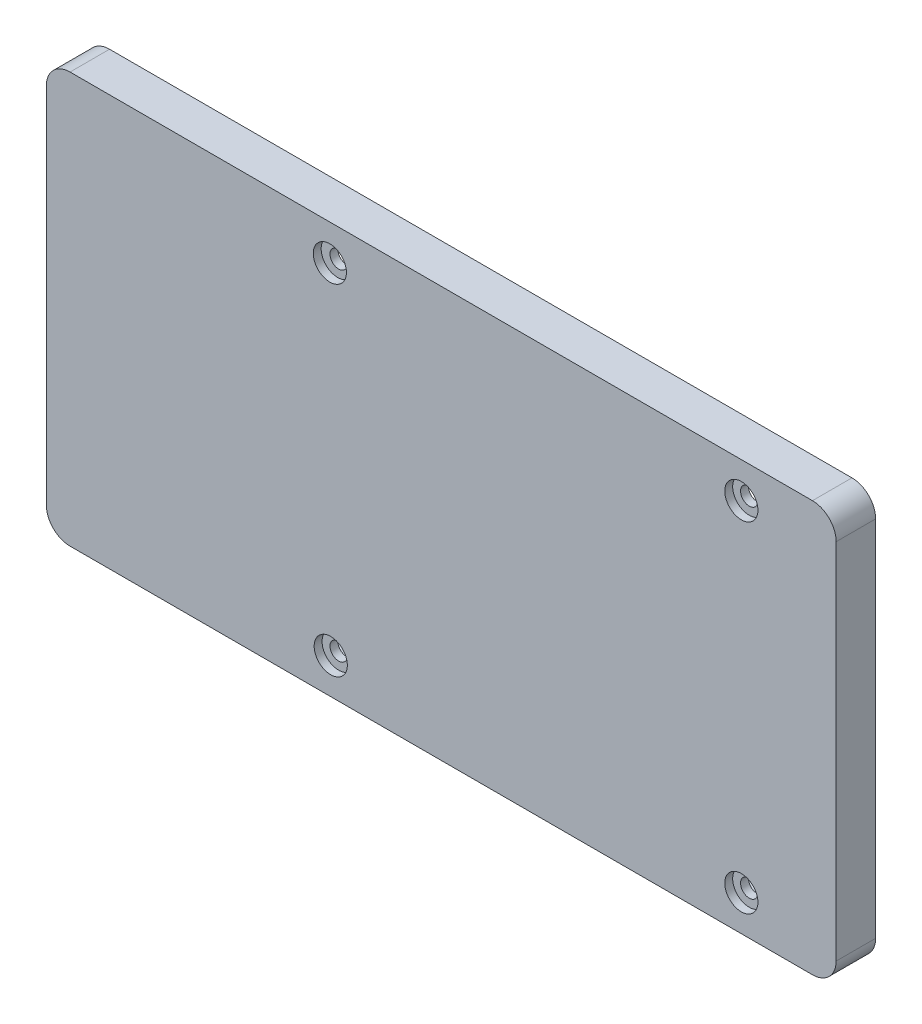
ISO-10303-21;
HEADER;
FILE_DESCRIPTION(('STEP AP214'),'2;1');
FILE_NAME('part.step','',(''),(''),'','','');
FILE_SCHEMA(('AUTOMOTIVE_DESIGN { 1 0 10303 214 1 1 1 1 }'));
ENDSEC;
DATA;
#1=APPLICATION_CONTEXT('core data for automotive mechanical design processes');
#2=APPLICATION_PROTOCOL_DEFINITION('international standard','automotive_design',2000,#1);
#3=PRODUCT_CONTEXT('',#1,'mechanical');
#4=PRODUCT('Part','Part','',(#3));
#5=PRODUCT_RELATED_PRODUCT_CATEGORY('part','',(#4));
#6=PRODUCT_DEFINITION_FORMATION('','',#4);
#7=PRODUCT_DEFINITION_CONTEXT('part definition',#1,'design');
#8=PRODUCT_DEFINITION('design','',#6,#7);
#9=PRODUCT_DEFINITION_SHAPE('','',#8);
#10=(LENGTH_UNIT() NAMED_UNIT(*) SI_UNIT(.MILLI.,.METRE.));
#11=(NAMED_UNIT(*) PLANE_ANGLE_UNIT() SI_UNIT($,.RADIAN.));
#12=(NAMED_UNIT(*) SI_UNIT($,.STERADIAN.) SOLID_ANGLE_UNIT());
#13=UNCERTAINTY_MEASURE_WITH_UNIT(LENGTH_MEASURE(1.E-05),#10,'distance_accuracy_value','');
#14=(GEOMETRIC_REPRESENTATION_CONTEXT(3) GLOBAL_UNCERTAINTY_ASSIGNED_CONTEXT((#13)) GLOBAL_UNIT_ASSIGNED_CONTEXT((#10,
#11,#12)) REPRESENTATION_CONTEXT('',''));
#15=CARTESIAN_POINT('',(0.,0.,0.));
#16=DIRECTION('',(0.,0.,1.));
#17=DIRECTION('',(1.,0.,0.));
#18=AXIS2_PLACEMENT_3D('',#15,#16,#17);
#19=CARTESIAN_POINT('',(972.388562725747,1041.63181831264,1066.88560292332));
#20=DIRECTION('',(0.,0.,1.));
#21=DIRECTION('',(1.,0.,0.));
#22=AXIS2_PLACEMENT_3D('',#19,#20,#21);
#23=CYLINDRICAL_SURFACE('',#22,1.09999999999997);
#24=CARTESIAN_POINT('',(972.388562725747,1041.63181831264,1069.88560292332));
#25=DIRECTION('',(0.,0.,-1.));
#26=DIRECTION('',(-1.,0.,0.));
#27=AXIS2_PLACEMENT_3D('',#24,#25,#26);
#28=CIRCLE('',#27,1.09999999999997);
#29=CARTESIAN_POINT('',(971.288562725748,1041.63181831264,1069.88560292332));
#30=VERTEX_POINT('',#29);
#31=EDGE_CURVE('E203',#30,#30,#28,.T.);
#32=ORIENTED_EDGE('',*,*,#31,.T.);
#33=EDGE_LOOP('',(#32));
#34=FACE_BOUND('',#33,.T.);
#35=CARTESIAN_POINT('',(972.388562725747,1041.63181831264,1070.88560292332));
#36=DIRECTION('',(0.,0.,1.));
#37=DIRECTION('',(1.,0.,0.));
#38=AXIS2_PLACEMENT_3D('',#35,#36,#37);
#39=CIRCLE('',#38,1.09999999999997);
#40=CARTESIAN_POINT('',(973.488562725747,1041.63181831264,1070.88560292332));
#41=VERTEX_POINT('',#40);
#42=EDGE_CURVE('E47',#41,#41,#39,.F.);
#43=ORIENTED_EDGE('',*,*,#42,.F.);
#44=EDGE_LOOP('',(#43));
#45=FACE_BOUND('',#44,.T.);
#46=ADVANCED_FACE('F43',(#34,#45),#23,.F.);
#47=CARTESIAN_POINT('',(972.388562725747,998.657114223238,1066.88560292332));
#48=DIRECTION('',(0.,0.,1.));
#49=DIRECTION('',(1.,0.,0.));
#50=AXIS2_PLACEMENT_3D('',#47,#48,#49);
#51=CYLINDRICAL_SURFACE('',#50,1.10000000000001);
#52=CARTESIAN_POINT('',(972.388562725747,998.657114223238,1069.88560292332));
#53=DIRECTION('',(0.,0.,-1.));
#54=DIRECTION('',(-1.,0.,0.));
#55=AXIS2_PLACEMENT_3D('',#52,#53,#54);
#56=CIRCLE('',#55,1.10000000000001);
#57=CARTESIAN_POINT('',(971.288562725748,998.657114223238,1069.88560292332));
#58=VERTEX_POINT('',#57);
#59=EDGE_CURVE('E207',#58,#58,#56,.T.);
#60=ORIENTED_EDGE('',*,*,#59,.T.);
#61=EDGE_LOOP('',(#60));
#62=FACE_BOUND('',#61,.T.);
#63=CARTESIAN_POINT('',(972.388562725747,998.657114223238,1070.88560292332));
#64=DIRECTION('',(0.,0.,1.));
#65=DIRECTION('',(1.,0.,0.));
#66=AXIS2_PLACEMENT_3D('',#63,#64,#65);
#67=CIRCLE('',#66,1.10000000000001);
#68=CARTESIAN_POINT('',(973.488562725747,998.657114223238,1070.88560292332));
#69=VERTEX_POINT('',#68);
#70=EDGE_CURVE('E316',#69,#69,#67,.F.);
#71=ORIENTED_EDGE('',*,*,#70,.F.);
#72=EDGE_LOOP('',(#71));
#73=FACE_BOUND('',#72,.T.);
#74=ADVANCED_FACE('F328',(#62,#73),#51,.F.);
#75=CARTESIAN_POINT('',(920.413762116146,998.657114223238,1066.88560292332));
#76=DIRECTION('',(0.,0.,1.));
#77=DIRECTION('',(1.,0.,0.));
#78=AXIS2_PLACEMENT_3D('',#75,#76,#77);
#79=CYLINDRICAL_SURFACE('',#78,1.10000000000001);
#80=CARTESIAN_POINT('',(920.413762116146,998.657114223238,1069.88560292332));
#81=DIRECTION('',(0.,0.,-1.));
#82=DIRECTION('',(-1.,0.,0.));
#83=AXIS2_PLACEMENT_3D('',#80,#81,#82);
#84=CIRCLE('',#83,1.10000000000001);
#85=CARTESIAN_POINT('',(919.313762116146,998.657114223238,1069.88560292332));
#86=VERTEX_POINT('',#85);
#87=EDGE_CURVE('E211',#86,#86,#84,.T.);
#88=ORIENTED_EDGE('',*,*,#87,.T.);
#89=EDGE_LOOP('',(#88));
#90=FACE_BOUND('',#89,.T.);
#91=CARTESIAN_POINT('',(920.413762116146,998.657114223238,1070.88560292332));
#92=DIRECTION('',(0.,0.,1.));
#93=DIRECTION('',(1.,0.,0.));
#94=AXIS2_PLACEMENT_3D('',#91,#92,#93);
#95=CIRCLE('',#94,1.10000000000001);
#96=CARTESIAN_POINT('',(921.513762116146,998.657114223238,1070.88560292332));
#97=VERTEX_POINT('',#96);
#98=EDGE_CURVE('E312',#97,#97,#95,.F.);
#99=ORIENTED_EDGE('',*,*,#98,.F.);
#100=EDGE_LOOP('',(#99));
#101=FACE_BOUND('',#100,.T.);
#102=ADVANCED_FACE('F334',(#90,#101),#79,.F.);
#103=CARTESIAN_POINT('',(920.413762116146,1041.63181831264,1066.88560292332));
#104=DIRECTION('',(0.,0.,1.));
#105=DIRECTION('',(1.,0.,0.));
#106=AXIS2_PLACEMENT_3D('',#103,#104,#105);
#107=CYLINDRICAL_SURFACE('',#106,1.09999999999997);
#108=CARTESIAN_POINT('',(920.413762116146,1041.63181831264,1069.88560292332));
#109=DIRECTION('',(0.,0.,-1.));
#110=DIRECTION('',(-1.,0.,0.));
#111=AXIS2_PLACEMENT_3D('',#108,#109,#110);
#112=CIRCLE('',#111,1.09999999999997);
#113=CARTESIAN_POINT('',(919.313762116146,1041.63181831264,1069.88560292332));
#114=VERTEX_POINT('',#113);
#115=EDGE_CURVE('E215',#114,#114,#112,.T.);
#116=ORIENTED_EDGE('',*,*,#115,.T.);
#117=EDGE_LOOP('',(#116));
#118=FACE_BOUND('',#117,.T.);
#119=CARTESIAN_POINT('',(920.413762116146,1041.63181831264,1070.88560292332));
#120=DIRECTION('',(0.,0.,1.));
#121=DIRECTION('',(1.,0.,0.));
#122=AXIS2_PLACEMENT_3D('',#119,#120,#121);
#123=CIRCLE('',#122,1.09999999999997);
#124=CARTESIAN_POINT('',(921.513762116146,1041.63181831264,1070.88560292332));
#125=VERTEX_POINT('',#124);
#126=EDGE_CURVE('E308',#125,#125,#123,.F.);
#127=ORIENTED_EDGE('',*,*,#126,.F.);
#128=EDGE_LOOP('',(#127));
#129=FACE_BOUND('',#128,.T.);
#130=ADVANCED_FACE('F339',(#118,#129),#107,.F.);
#131=CARTESIAN_POINT('',(884.413762116146,1046.13181831264,1071.88560292332));
#132=DIRECTION('',(1.,0.,0.));
#133=DIRECTION('',(0.,0.,-1.));
#134=AXIS2_PLACEMENT_3D('',#131,#132,#133);
#135=PLANE('',#134);
#136=DIRECTION('',(0.,-1.,0.));
#137=VECTOR('',#136,1.);
#138=CARTESIAN_POINT('',(884.413762116146,1046.13181831264,1066.88560292332));
#139=LINE('',#138,#137);
#140=CARTESIAN_POINT('',(884.413762116146,1043.13181831264,1066.88560292332));
#141=VERTEX_POINT('',#140);
#142=CARTESIAN_POINT('',(884.413762116146,997.157114223238,1066.88560292332));
#143=VERTEX_POINT('',#142);
#144=EDGE_CURVE('E188',#141,#143,#139,.T.);
#145=ORIENTED_EDGE('',*,*,#144,.T.);
#146=DIRECTION('',(0.,0.,-1.));
#147=VECTOR('',#146,1.);
#148=CARTESIAN_POINT('',(884.413762116146,997.157114223238,1071.88560292332));
#149=LINE('',#148,#147);
#150=CARTESIAN_POINT('',(884.413762116146,997.157114223238,1071.88560292332));
#151=VERTEX_POINT('',#150);
#152=EDGE_CURVE('E163',#143,#151,#149,.F.);
#153=ORIENTED_EDGE('',*,*,#152,.T.);
#154=DIRECTION('',(0.,-1.,0.));
#155=VECTOR('',#154,1.);
#156=CARTESIAN_POINT('',(884.413762116146,1046.13181831264,1071.88560292332));
#157=LINE('',#156,#155);
#158=CARTESIAN_POINT('',(884.413762116146,1043.13181831264,1071.88560292332));
#159=VERTEX_POINT('',#158);
#160=EDGE_CURVE('E202',#159,#151,#157,.T.);
#161=ORIENTED_EDGE('',*,*,#160,.F.);
#162=DIRECTION('',(0.,0.,-1.));
#163=VECTOR('',#162,1.);
#164=CARTESIAN_POINT('',(884.413762116146,1043.13181831264,1071.88560292332));
#165=LINE('',#164,#163);
#166=EDGE_CURVE('E169',#159,#141,#165,.T.);
#167=ORIENTED_EDGE('',*,*,#166,.T.);
#168=EDGE_LOOP('',(#145,#153,#161,#167));
#169=FACE_BOUND('',#168,.T.);
#170=ADVANCED_FACE('F377',(#169),#135,.F.);
#171=CARTESIAN_POINT('',(884.413762116146,994.157114223238,1071.88560292332));
#172=DIRECTION('',(0.,1.,0.));
#173=DIRECTION('',(0.,0.,1.));
#174=AXIS2_PLACEMENT_3D('',#171,#172,#173);
#175=PLANE('',#174);
#176=DIRECTION('',(1.,0.,0.));
#177=VECTOR('',#176,1.);
#178=CARTESIAN_POINT('',(884.413762116146,994.157114223238,1071.88560292332));
#179=LINE('',#178,#177);
#180=CARTESIAN_POINT('',(887.413762116146,994.157114223238,1071.88560292332));
#181=VERTEX_POINT('',#180);
#182=CARTESIAN_POINT('',(981.388562725748,994.157114223238,1071.88560292332));
#183=VERTEX_POINT('',#182);
#184=EDGE_CURVE('E179',#181,#183,#179,.T.);
#185=ORIENTED_EDGE('',*,*,#184,.F.);
#186=DIRECTION('',(0.,0.,-1.));
#187=VECTOR('',#186,1.);
#188=CARTESIAN_POINT('',(887.413762116146,994.157114223238,1071.88560292332));
#189=LINE('',#188,#187);
#190=CARTESIAN_POINT('',(887.413762116146,994.157114223238,1066.88560292332));
#191=VERTEX_POINT('',#190);
#192=EDGE_CURVE('E162',#181,#191,#189,.T.);
#193=ORIENTED_EDGE('',*,*,#192,.T.);
#194=DIRECTION('',(1.,0.,0.));
#195=VECTOR('',#194,1.);
#196=CARTESIAN_POINT('',(884.413762116146,994.157114223238,1066.88560292332));
#197=LINE('',#196,#195);
#198=CARTESIAN_POINT('',(981.388562725748,994.157114223238,1066.88560292332));
#199=VERTEX_POINT('',#198);
#200=EDGE_CURVE('E176',#191,#199,#197,.T.);
#201=ORIENTED_EDGE('',*,*,#200,.T.);
#202=DIRECTION('',(0.,0.,-1.));
#203=VECTOR('',#202,1.);
#204=CARTESIAN_POINT('',(981.388562725748,994.157114223238,1071.88560292332));
#205=LINE('',#204,#203);
#206=EDGE_CURVE('E182',#199,#183,#205,.F.);
#207=ORIENTED_EDGE('',*,*,#206,.T.);
#208=EDGE_LOOP('',(#185,#193,#201,#207));
#209=FACE_BOUND('',#208,.T.);
#210=ADVANCED_FACE('F175',(#209),#175,.F.);
#211=CARTESIAN_POINT('',(984.388562725748,1046.13181831264,1071.88560292332));
#212=DIRECTION('',(-1.,0.,0.));
#213=DIRECTION('',(0.,0.,1.));
#214=AXIS2_PLACEMENT_3D('',#211,#212,#213);
#215=PLANE('',#214);
#216=DIRECTION('',(0.,1.,0.));
#217=VECTOR('',#216,1.);
#218=CARTESIAN_POINT('',(984.388562725748,1046.13181831264,1071.88560292332));
#219=LINE('',#218,#217);
#220=CARTESIAN_POINT('',(984.388562725748,997.157114223238,1071.88560292332));
#221=VERTEX_POINT('',#220);
#222=CARTESIAN_POINT('',(984.388562725748,1043.13181831264,1071.88560292332));
#223=VERTEX_POINT('',#222);
#224=EDGE_CURVE('E453',#221,#223,#219,.T.);
#225=ORIENTED_EDGE('',*,*,#224,.F.);
#226=DIRECTION('',(0.,0.,-1.));
#227=VECTOR('',#226,1.);
#228=CARTESIAN_POINT('',(984.388562725748,997.157114223238,1071.88560292332));
#229=LINE('',#228,#227);
#230=CARTESIAN_POINT('',(984.388562725748,997.157114223238,1066.88560292332));
#231=VERTEX_POINT('',#230);
#232=EDGE_CURVE('E250',#221,#231,#229,.T.);
#233=ORIENTED_EDGE('',*,*,#232,.T.);
#234=DIRECTION('',(0.,1.,0.));
#235=VECTOR('',#234,1.);
#236=CARTESIAN_POINT('',(984.388562725748,1046.13181831264,1066.88560292332));
#237=LINE('',#236,#235);
#238=CARTESIAN_POINT('',(984.388562725748,1043.13181831264,1066.88560292332));
#239=VERTEX_POINT('',#238);
#240=EDGE_CURVE('E187',#231,#239,#237,.T.);
#241=ORIENTED_EDGE('',*,*,#240,.T.);
#242=DIRECTION('',(0.,0.,-1.));
#243=VECTOR('',#242,1.);
#244=CARTESIAN_POINT('',(984.388562725748,1043.13181831264,1071.88560292332));
#245=LINE('',#244,#243);
#246=EDGE_CURVE('E247',#239,#223,#245,.F.);
#247=ORIENTED_EDGE('',*,*,#246,.T.);
#248=EDGE_LOOP('',(#225,#233,#241,#247));
#249=FACE_BOUND('',#248,.T.);
#250=ADVANCED_FACE('F370',(#249),#215,.F.);
#251=CARTESIAN_POINT('',(884.413762116146,1046.13181831264,1071.88560292332));
#252=DIRECTION('',(0.,-1.,0.));
#253=DIRECTION('',(0.,0.,-1.));
#254=AXIS2_PLACEMENT_3D('',#251,#252,#253);
#255=PLANE('',#254);
#256=DIRECTION('',(-1.,0.,0.));
#257=VECTOR('',#256,1.);
#258=CARTESIAN_POINT('',(884.413762116146,1046.13181831264,1071.88560292332));
#259=LINE('',#258,#257);
#260=CARTESIAN_POINT('',(981.388562725748,1046.13181831264,1071.88560292332));
#261=VERTEX_POINT('',#260);
#262=CARTESIAN_POINT('',(887.413762116146,1046.13181831264,1071.88560292332));
#263=VERTEX_POINT('',#262);
#264=EDGE_CURVE('E221',#261,#263,#259,.T.);
#265=ORIENTED_EDGE('',*,*,#264,.F.);
#266=DIRECTION('',(0.,0.,-1.));
#267=VECTOR('',#266,1.);
#268=CARTESIAN_POINT('',(981.388562725748,1046.13181831264,1071.88560292332));
#269=LINE('',#268,#267);
#270=CARTESIAN_POINT('',(981.388562725748,1046.13181831264,1066.88560292332));
#271=VERTEX_POINT('',#270);
#272=EDGE_CURVE('E257',#261,#271,#269,.T.);
#273=ORIENTED_EDGE('',*,*,#272,.T.);
#274=DIRECTION('',(-1.,0.,0.));
#275=VECTOR('',#274,1.);
#276=CARTESIAN_POINT('',(884.413762116146,1046.13181831264,1066.88560292332));
#277=LINE('',#276,#275);
#278=CARTESIAN_POINT('',(887.413762116146,1046.13181831264,1066.88560292332));
#279=VERTEX_POINT('',#278);
#280=EDGE_CURVE('E193',#271,#279,#277,.T.);
#281=ORIENTED_EDGE('',*,*,#280,.T.);
#282=DIRECTION('',(0.,0.,-1.));
#283=VECTOR('',#282,1.);
#284=CARTESIAN_POINT('',(887.413762116146,1046.13181831264,1071.88560292332));
#285=LINE('',#284,#283);
#286=EDGE_CURVE('E254',#279,#263,#285,.F.);
#287=ORIENTED_EDGE('',*,*,#286,.T.);
#288=EDGE_LOOP('',(#265,#273,#281,#287));
#289=FACE_BOUND('',#288,.T.);
#290=ADVANCED_FACE('F364',(#289),#255,.F.);
#291=CARTESIAN_POINT('',(0.,0.,1071.88560292332));
#292=DIRECTION('',(0.,0.,1.));
#293=DIRECTION('',(1.,0.,0.));
#294=AXIS2_PLACEMENT_3D('',#291,#292,#293);
#295=PLANE('',#294);
#296=CARTESIAN_POINT('',(920.413762116146,998.657114223238,1071.88560292332));
#297=DIRECTION('',(0.,0.,1.));
#298=DIRECTION('',(1.,0.,0.));
#299=AXIS2_PLACEMENT_3D('',#296,#297,#298);
#300=CIRCLE('',#299,2.10000000000006);
#301=CARTESIAN_POINT('',(922.513762116146,998.657114223238,1071.88560292332));
#302=VERTEX_POINT('',#301);
#303=EDGE_CURVE('E492',#302,#302,#300,.T.);
#304=ORIENTED_EDGE('',*,*,#303,.F.);
#305=EDGE_LOOP('',(#304));
#306=FACE_BOUND('',#305,.T.);
#307=CARTESIAN_POINT('',(972.388562725747,998.657114223238,1071.88560292332));
#308=DIRECTION('',(0.,0.,1.));
#309=DIRECTION('',(1.,0.,0.));
#310=AXIS2_PLACEMENT_3D('',#307,#308,#309);
#311=CIRCLE('',#310,2.10000000000006);
#312=CARTESIAN_POINT('',(974.488562725748,998.657114223238,1071.88560292332));
#313=VERTEX_POINT('',#312);
#314=EDGE_CURVE('E500',#313,#313,#311,.T.);
#315=ORIENTED_EDGE('',*,*,#314,.F.);
#316=EDGE_LOOP('',(#315));
#317=FACE_BOUND('',#316,.T.);
#318=CARTESIAN_POINT('',(972.388562725747,1041.63181831264,1071.88560292332));
#319=DIRECTION('',(0.,0.,1.));
#320=DIRECTION('',(1.,0.,0.));
#321=AXIS2_PLACEMENT_3D('',#318,#319,#320);
#322=CIRCLE('',#321,2.10000000000002);
#323=CARTESIAN_POINT('',(974.488562725747,1041.63181831264,1071.88560292332));
#324=VERTEX_POINT('',#323);
#325=EDGE_CURVE('E484',#324,#324,#322,.T.);
#326=ORIENTED_EDGE('',*,*,#325,.F.);
#327=EDGE_LOOP('',(#326));
#328=FACE_BOUND('',#327,.T.);
#329=CARTESIAN_POINT('',(920.299535547693,1041.64450817802,1071.88560292332));
#330=DIRECTION('',(0.,0.,1.));
#331=DIRECTION('',(1.,0.,0.));
#332=AXIS2_PLACEMENT_3D('',#329,#330,#331);
#333=CIRCLE('',#332,2.10000000000002);
#334=CARTESIAN_POINT('',(922.399535547693,1041.64450817802,1071.88560292332));
#335=VERTEX_POINT('',#334);
#336=EDGE_CURVE('E480',#335,#335,#333,.T.);
#337=ORIENTED_EDGE('',*,*,#336,.F.);
#338=EDGE_LOOP('',(#337));
#339=FACE_BOUND('',#338,.T.);
#340=ORIENTED_EDGE('',*,*,#160,.T.);
#341=CARTESIAN_POINT('',(887.413762116146,997.157114223238,1071.88560292332));
#342=DIRECTION('',(0.,0.,1.));
#343=DIRECTION('',(1.,0.,0.));
#344=AXIS2_PLACEMENT_3D('',#341,#342,#343);
#345=CIRCLE('',#344,3.);
#346=EDGE_CURVE('E244',#151,#181,#345,.T.);
#347=ORIENTED_EDGE('',*,*,#346,.T.);
#348=ORIENTED_EDGE('',*,*,#184,.T.);
#349=CARTESIAN_POINT('',(981.388562725748,997.157114223238,1071.88560292332));
#350=DIRECTION('',(0.,0.,1.));
#351=DIRECTION('',(1.,0.,0.));
#352=AXIS2_PLACEMENT_3D('',#349,#350,#351);
#353=CIRCLE('',#352,3.);
#354=EDGE_CURVE('E241',#183,#221,#353,.T.);
#355=ORIENTED_EDGE('',*,*,#354,.T.);
#356=ORIENTED_EDGE('',*,*,#224,.T.);
#357=CARTESIAN_POINT('',(981.388562725748,1043.13181831264,1071.88560292332));
#358=DIRECTION('',(0.,0.,1.));
#359=DIRECTION('',(1.,0.,0.));
#360=AXIS2_PLACEMENT_3D('',#357,#358,#359);
#361=CIRCLE('',#360,3.);
#362=EDGE_CURVE('E238',#223,#261,#361,.T.);
#363=ORIENTED_EDGE('',*,*,#362,.T.);
#364=ORIENTED_EDGE('',*,*,#264,.T.);
#365=CARTESIAN_POINT('',(887.413762116146,1043.13181831264,1071.88560292332));
#366=DIRECTION('',(0.,0.,1.));
#367=DIRECTION('',(1.,0.,0.));
#368=AXIS2_PLACEMENT_3D('',#365,#366,#367);
#369=CIRCLE('',#368,3.);
#370=EDGE_CURVE('E235',#263,#159,#369,.T.);
#371=ORIENTED_EDGE('',*,*,#370,.T.);
#372=EDGE_LOOP('',(#340,#347,#348,#355,#356,#363,#364,#371));
#373=FACE_BOUND('',#372,.T.);
#374=ADVANCED_FACE('F361',(#306,#317,#328,#339,#373),#295,.T.);
#375=CARTESIAN_POINT('',(0.,0.,1066.88560292332));
#376=DIRECTION('',(0.,0.,1.));
#377=DIRECTION('',(1.,0.,0.));
#378=AXIS2_PLACEMENT_3D('',#375,#376,#377);
#379=PLANE('',#378);
#380=DIRECTION('',(-1.,0.,0.));
#381=VECTOR('',#380,1.);
#382=CARTESIAN_POINT('',(982.888562725748,995.657114223238,1066.88560292332));
#383=LINE('',#382,#381);
#384=CARTESIAN_POINT('',(980.888562725748,995.657114223238,1066.88560292332));
#385=VERTEX_POINT('',#384);
#386=CARTESIAN_POINT('',(887.913762116146,995.657114223238,1066.88560292332));
#387=VERTEX_POINT('',#386);
#388=EDGE_CURVE('E438',#385,#387,#383,.T.);
#389=ORIENTED_EDGE('',*,*,#388,.F.);
#390=CARTESIAN_POINT('',(980.888562725748,997.657114223238,1066.88560292332));
#391=DIRECTION('',(0.,0.,1.));
#392=DIRECTION('',(1.,0.,0.));
#393=AXIS2_PLACEMENT_3D('',#390,#391,#392);
#394=CIRCLE('',#393,2.);
#395=CARTESIAN_POINT('',(982.888562725748,997.657114223238,1066.88560292332));
#396=VERTEX_POINT('',#395);
#397=EDGE_CURVE('E53',#385,#396,#394,.T.);
#398=ORIENTED_EDGE('',*,*,#397,.T.);
#399=DIRECTION('',(0.,-1.,0.));
#400=VECTOR('',#399,1.);
#401=CARTESIAN_POINT('',(982.888562725748,1044.38797782496,1066.88560292332));
#402=LINE('',#401,#400);
#403=CARTESIAN_POINT('',(982.888562725748,1042.38797782496,1066.88560292332));
#404=VERTEX_POINT('',#403);
#405=EDGE_CURVE('E219',#404,#396,#402,.T.);
#406=ORIENTED_EDGE('',*,*,#405,.F.);
#407=CARTESIAN_POINT('',(980.888562725748,1042.38797782496,1066.88560292332));
#408=DIRECTION('',(0.,0.,1.));
#409=DIRECTION('',(1.,0.,0.));
#410=AXIS2_PLACEMENT_3D('',#407,#408,#409);
#411=CIRCLE('',#410,2.);
#412=CARTESIAN_POINT('',(980.888562725748,1044.38797782496,1066.88560292332));
#413=VERTEX_POINT('',#412);
#414=EDGE_CURVE('E11',#404,#413,#411,.T.);
#415=ORIENTED_EDGE('',*,*,#414,.T.);
#416=DIRECTION('',(1.,0.,0.));
#417=VECTOR('',#416,1.);
#418=CARTESIAN_POINT('',(982.888562725748,1044.38797782496,1066.88560292332));
#419=LINE('',#418,#417);
#420=CARTESIAN_POINT('',(887.913762116146,1044.38797782496,1066.88560292332));
#421=VERTEX_POINT('',#420);
#422=EDGE_CURVE('E429',#421,#413,#419,.T.);
#423=ORIENTED_EDGE('',*,*,#422,.F.);
#424=CARTESIAN_POINT('',(887.913762116146,1042.38797782496,1066.88560292332));
#425=DIRECTION('',(0.,0.,1.));
#426=DIRECTION('',(1.,0.,0.));
#427=AXIS2_PLACEMENT_3D('',#424,#425,#426);
#428=CIRCLE('',#427,2.);
#429=CARTESIAN_POINT('',(885.913762116146,1042.38797782496,1066.88560292332));
#430=VERTEX_POINT('',#429);
#431=EDGE_CURVE('E300',#421,#430,#428,.T.);
#432=ORIENTED_EDGE('',*,*,#431,.T.);
#433=DIRECTION('',(0.,1.,0.));
#434=VECTOR('',#433,1.);
#435=CARTESIAN_POINT('',(885.913762116146,1044.38797782496,1066.88560292332));
#436=LINE('',#435,#434);
#437=CARTESIAN_POINT('',(885.913762116146,997.657114223238,1066.88560292332));
#438=VERTEX_POINT('',#437);
#439=EDGE_CURVE('E441',#438,#430,#436,.T.);
#440=ORIENTED_EDGE('',*,*,#439,.F.);
#441=CARTESIAN_POINT('',(887.913762116146,997.657114223238,1066.88560292332));
#442=DIRECTION('',(0.,0.,1.));
#443=DIRECTION('',(1.,0.,0.));
#444=AXIS2_PLACEMENT_3D('',#441,#442,#443);
#445=CIRCLE('',#444,2.);
#446=EDGE_CURVE('E303',#438,#387,#445,.T.);
#447=ORIENTED_EDGE('',*,*,#446,.T.);
#448=EDGE_LOOP('',(#389,#398,#406,#415,#423,#432,#440,#447));
#449=FACE_BOUND('',#448,.T.);
#450=ORIENTED_EDGE('',*,*,#200,.F.);
#451=CARTESIAN_POINT('',(887.413762116146,997.157114223238,1066.88560292332));
#452=DIRECTION('',(0.,0.,1.));
#453=DIRECTION('',(1.,0.,0.));
#454=AXIS2_PLACEMENT_3D('',#451,#452,#453);
#455=CIRCLE('',#454,3.);
#456=EDGE_CURVE('E158',#191,#143,#455,.F.);
#457=ORIENTED_EDGE('',*,*,#456,.T.);
#458=ORIENTED_EDGE('',*,*,#144,.F.);
#459=CARTESIAN_POINT('',(887.413762116146,1043.13181831264,1066.88560292332));
#460=DIRECTION('',(0.,0.,1.));
#461=DIRECTION('',(1.,0.,0.));
#462=AXIS2_PLACEMENT_3D('',#459,#460,#461);
#463=CIRCLE('',#462,3.);
#464=EDGE_CURVE('E181',#141,#279,#463,.F.);
#465=ORIENTED_EDGE('',*,*,#464,.T.);
#466=ORIENTED_EDGE('',*,*,#280,.F.);
#467=CARTESIAN_POINT('',(981.388562725748,1043.13181831264,1066.88560292332));
#468=DIRECTION('',(0.,0.,1.));
#469=DIRECTION('',(1.,0.,0.));
#470=AXIS2_PLACEMENT_3D('',#467,#468,#469);
#471=CIRCLE('',#470,3.);
#472=EDGE_CURVE('E225',#271,#239,#471,.F.);
#473=ORIENTED_EDGE('',*,*,#472,.T.);
#474=ORIENTED_EDGE('',*,*,#240,.F.);
#475=CARTESIAN_POINT('',(981.388562725748,997.157114223238,1066.88560292332));
#476=DIRECTION('',(0.,0.,1.));
#477=DIRECTION('',(1.,0.,0.));
#478=AXIS2_PLACEMENT_3D('',#475,#476,#477);
#479=CIRCLE('',#478,3.);
#480=EDGE_CURVE('E170',#231,#199,#479,.F.);
#481=ORIENTED_EDGE('',*,*,#480,.T.);
#482=EDGE_LOOP('',(#450,#457,#458,#465,#466,#473,#474,#481));
#483=FACE_BOUND('',#482,.T.);
#484=ADVANCED_FACE('F184',(#449,#483),#379,.F.);
#485=CARTESIAN_POINT('',(982.888562725748,1044.38797782496,1069.88560292332));
#486=DIRECTION('',(1.,0.,0.));
#487=DIRECTION('',(0.,0.,-1.));
#488=AXIS2_PLACEMENT_3D('',#485,#486,#487);
#489=PLANE('',#488);
#490=ORIENTED_EDGE('',*,*,#405,.T.);
#491=DIRECTION('',(0.,0.,-1.));
#492=VECTOR('',#491,1.);
#493=CARTESIAN_POINT('',(982.888562725748,997.657114223238,1069.88560292332));
#494=LINE('',#493,#492);
#495=CARTESIAN_POINT('',(982.888562725748,997.657114223238,1069.88560292332));
#496=VERTEX_POINT('',#495);
#497=EDGE_CURVE('E297',#396,#496,#494,.F.);
#498=ORIENTED_EDGE('',*,*,#497,.T.);
#499=DIRECTION('',(0.,-1.,0.));
#500=VECTOR('',#499,1.);
#501=CARTESIAN_POINT('',(982.888562725748,1044.38797782496,1069.88560292332));
#502=LINE('',#501,#500);
#503=CARTESIAN_POINT('',(982.888562725748,1042.38797782496,1069.88560292332));
#504=VERTEX_POINT('',#503);
#505=EDGE_CURVE('E420',#504,#496,#502,.T.);
#506=ORIENTED_EDGE('',*,*,#505,.F.);
#507=DIRECTION('',(0.,0.,-1.));
#508=VECTOR('',#507,1.);
#509=CARTESIAN_POINT('',(982.888562725748,1042.38797782496,1066.88560292332));
#510=LINE('',#509,#508);
#511=EDGE_CURVE('E294',#504,#404,#510,.T.);
#512=ORIENTED_EDGE('',*,*,#511,.T.);
#513=EDGE_LOOP('',(#490,#498,#506,#512));
#514=FACE_BOUND('',#513,.T.);
#515=ADVANCED_FACE('F350',(#514),#489,.F.);
#516=CARTESIAN_POINT('',(982.888562725748,1044.38797782496,1069.88560292332));
#517=DIRECTION('',(0.,1.,0.));
#518=DIRECTION('',(0.,0.,1.));
#519=AXIS2_PLACEMENT_3D('',#516,#517,#518);
#520=PLANE('',#519);
#521=DIRECTION('',(1.,0.,0.));
#522=VECTOR('',#521,1.);
#523=CARTESIAN_POINT('',(982.888562725748,1044.38797782496,1069.88560292332));
#524=LINE('',#523,#522);
#525=CARTESIAN_POINT('',(887.913762116146,1044.38797782496,1069.88560292332));
#526=VERTEX_POINT('',#525);
#527=CARTESIAN_POINT('',(980.888562725748,1044.38797782496,1069.88560292332));
#528=VERTEX_POINT('',#527);
#529=EDGE_CURVE('E195',#526,#528,#524,.T.);
#530=ORIENTED_EDGE('',*,*,#529,.F.);
#531=DIRECTION('',(0.,0.,-1.));
#532=VECTOR('',#531,1.);
#533=CARTESIAN_POINT('',(887.913762116146,1044.38797782496,1066.88560292332));
#534=LINE('',#533,#532);
#535=EDGE_CURVE('E264',#526,#421,#534,.T.);
#536=ORIENTED_EDGE('',*,*,#535,.T.);
#537=ORIENTED_EDGE('',*,*,#422,.T.);
#538=DIRECTION('',(0.,0.,-1.));
#539=VECTOR('',#538,1.);
#540=CARTESIAN_POINT('',(980.888562725748,1044.38797782496,1069.88560292332));
#541=LINE('',#540,#539);
#542=EDGE_CURVE('E261',#413,#528,#541,.F.);
#543=ORIENTED_EDGE('',*,*,#542,.T.);
#544=EDGE_LOOP('',(#530,#536,#537,#543));
#545=FACE_BOUND('',#544,.T.);
#546=ADVANCED_FACE('F346',(#545),#520,.F.);
#547=CARTESIAN_POINT('',(885.913762116146,1044.38797782496,1069.88560292332));
#548=DIRECTION('',(-1.,0.,0.));
#549=DIRECTION('',(0.,0.,1.));
#550=AXIS2_PLACEMENT_3D('',#547,#548,#549);
#551=PLANE('',#550);
#552=ORIENTED_EDGE('',*,*,#439,.T.);
#553=DIRECTION('',(0.,0.,-1.));
#554=VECTOR('',#553,1.);
#555=CARTESIAN_POINT('',(885.913762116146,1042.38797782496,1069.88560292332));
#556=LINE('',#555,#554);
#557=CARTESIAN_POINT('',(885.913762116146,1042.38797782496,1069.88560292332));
#558=VERTEX_POINT('',#557);
#559=EDGE_CURVE('E272',#430,#558,#556,.F.);
#560=ORIENTED_EDGE('',*,*,#559,.T.);
#561=DIRECTION('',(0.,1.,0.));
#562=VECTOR('',#561,1.);
#563=CARTESIAN_POINT('',(885.913762116146,1044.38797782496,1069.88560292332));
#564=LINE('',#563,#562);
#565=CARTESIAN_POINT('',(885.913762116146,997.657114223238,1069.88560292332));
#566=VERTEX_POINT('',#565);
#567=EDGE_CURVE('E424',#566,#558,#564,.T.);
#568=ORIENTED_EDGE('',*,*,#567,.F.);
#569=DIRECTION('',(0.,0.,-1.));
#570=VECTOR('',#569,1.);
#571=CARTESIAN_POINT('',(885.913762116146,997.657114223238,1066.88560292332));
#572=LINE('',#571,#570);
#573=EDGE_CURVE('E268',#566,#438,#572,.T.);
#574=ORIENTED_EDGE('',*,*,#573,.T.);
#575=EDGE_LOOP('',(#552,#560,#568,#574));
#576=FACE_BOUND('',#575,.T.);
#577=ADVANCED_FACE('F349',(#576),#551,.F.);
#578=CARTESIAN_POINT('',(982.888562725748,995.657114223238,1069.88560292332));
#579=DIRECTION('',(0.,-1.,0.));
#580=DIRECTION('',(0.,0.,-1.));
#581=AXIS2_PLACEMENT_3D('',#578,#579,#580);
#582=PLANE('',#581);
#583=ORIENTED_EDGE('',*,*,#388,.T.);
#584=DIRECTION('',(0.,0.,-1.));
#585=VECTOR('',#584,1.);
#586=CARTESIAN_POINT('',(887.913762116146,995.657114223238,1069.88560292332));
#587=LINE('',#586,#585);
#588=CARTESIAN_POINT('',(887.913762116146,995.657114223238,1069.88560292332));
#589=VERTEX_POINT('',#588);
#590=EDGE_CURVE('E291',#387,#589,#587,.F.);
#591=ORIENTED_EDGE('',*,*,#590,.T.);
#592=DIRECTION('',(-1.,0.,0.));
#593=VECTOR('',#592,1.);
#594=CARTESIAN_POINT('',(982.888562725748,995.657114223238,1069.88560292332));
#595=LINE('',#594,#593);
#596=CARTESIAN_POINT('',(980.888562725748,995.657114223238,1069.88560292332));
#597=VERTEX_POINT('',#596);
#598=EDGE_CURVE('E417',#597,#589,#595,.T.);
#599=ORIENTED_EDGE('',*,*,#598,.F.);
#600=DIRECTION('',(0.,0.,-1.));
#601=VECTOR('',#600,1.);
#602=CARTESIAN_POINT('',(980.888562725748,995.657114223238,1066.88560292332));
#603=LINE('',#602,#601);
#604=EDGE_CURVE('E287',#597,#385,#603,.T.);
#605=ORIENTED_EDGE('',*,*,#604,.T.);
#606=EDGE_LOOP('',(#583,#591,#599,#605));
#607=FACE_BOUND('',#606,.T.);
#608=ADVANCED_FACE('F344',(#607),#582,.F.);
#609=CARTESIAN_POINT('',(0.,0.,1069.88560292332));
#610=DIRECTION('',(0.,0.,-1.));
#611=DIRECTION('',(-1.,0.,0.));
#612=AXIS2_PLACEMENT_3D('',#609,#610,#611);
#613=PLANE('',#612);
#614=ORIENTED_EDGE('',*,*,#115,.F.);
#615=EDGE_LOOP('',(#614));
#616=FACE_BOUND('',#615,.T.);
#617=ORIENTED_EDGE('',*,*,#87,.F.);
#618=EDGE_LOOP('',(#617));
#619=FACE_BOUND('',#618,.T.);
#620=ORIENTED_EDGE('',*,*,#59,.F.);
#621=EDGE_LOOP('',(#620));
#622=FACE_BOUND('',#621,.T.);
#623=ORIENTED_EDGE('',*,*,#31,.F.);
#624=EDGE_LOOP('',(#623));
#625=FACE_BOUND('',#624,.T.);
#626=ORIENTED_EDGE('',*,*,#567,.T.);
#627=CARTESIAN_POINT('',(887.913762116146,1042.38797782496,1069.88560292332));
#628=DIRECTION('',(0.,0.,-1.));
#629=DIRECTION('',(-1.,0.,0.));
#630=AXIS2_PLACEMENT_3D('',#627,#628,#629);
#631=CIRCLE('',#630,2.);
#632=EDGE_CURVE('E284',#558,#526,#631,.T.);
#633=ORIENTED_EDGE('',*,*,#632,.T.);
#634=ORIENTED_EDGE('',*,*,#529,.T.);
#635=CARTESIAN_POINT('',(980.888562725748,1042.38797782496,1069.88560292332));
#636=DIRECTION('',(0.,0.,-1.));
#637=DIRECTION('',(-1.,0.,0.));
#638=AXIS2_PLACEMENT_3D('',#635,#636,#637);
#639=CIRCLE('',#638,2.);
#640=EDGE_CURVE('E275',#528,#504,#639,.T.);
#641=ORIENTED_EDGE('',*,*,#640,.T.);
#642=ORIENTED_EDGE('',*,*,#505,.T.);
#643=CARTESIAN_POINT('',(980.888562725748,997.657114223238,1069.88560292332));
#644=DIRECTION('',(0.,0.,-1.));
#645=DIRECTION('',(-1.,0.,0.));
#646=AXIS2_PLACEMENT_3D('',#643,#644,#645);
#647=CIRCLE('',#646,2.);
#648=EDGE_CURVE('E278',#496,#597,#647,.T.);
#649=ORIENTED_EDGE('',*,*,#648,.T.);
#650=ORIENTED_EDGE('',*,*,#598,.T.);
#651=CARTESIAN_POINT('',(887.913762116146,997.657114223238,1069.88560292332));
#652=DIRECTION('',(0.,0.,-1.));
#653=DIRECTION('',(-1.,0.,0.));
#654=AXIS2_PLACEMENT_3D('',#651,#652,#653);
#655=CIRCLE('',#654,2.);
#656=EDGE_CURVE('E281',#589,#566,#655,.T.);
#657=ORIENTED_EDGE('',*,*,#656,.T.);
#658=EDGE_LOOP('',(#626,#633,#634,#641,#642,#649,#650,#657));
#659=FACE_BOUND('',#658,.T.);
#660=ADVANCED_FACE('F341',(#616,#619,#622,#625,#659),#613,.T.);
#661=CARTESIAN_POINT('',(887.413762116146,997.157114223238,1071.88560292332));
#662=DIRECTION('',(0.,0.,-1.));
#663=DIRECTION('',(-1.,0.,0.));
#664=AXIS2_PLACEMENT_3D('',#661,#662,#663);
#665=CYLINDRICAL_SURFACE('',#664,3.);
#666=ORIENTED_EDGE('',*,*,#346,.F.);
#667=ORIENTED_EDGE('',*,*,#152,.F.);
#668=ORIENTED_EDGE('',*,*,#456,.F.);
#669=ORIENTED_EDGE('',*,*,#192,.F.);
#670=EDGE_LOOP('',(#666,#667,#668,#669));
#671=FACE_BOUND('',#670,.T.);
#672=ADVANCED_FACE('F161',(#671),#665,.T.);
#673=CARTESIAN_POINT('',(981.388562725748,997.157114223238,1071.88560292332));
#674=DIRECTION('',(0.,0.,-1.));
#675=DIRECTION('',(-1.,0.,0.));
#676=AXIS2_PLACEMENT_3D('',#673,#674,#675);
#677=CYLINDRICAL_SURFACE('',#676,3.);
#678=ORIENTED_EDGE('',*,*,#354,.F.);
#679=ORIENTED_EDGE('',*,*,#206,.F.);
#680=ORIENTED_EDGE('',*,*,#480,.F.);
#681=ORIENTED_EDGE('',*,*,#232,.F.);
#682=EDGE_LOOP('',(#678,#679,#680,#681));
#683=FACE_BOUND('',#682,.T.);
#684=ADVANCED_FACE('F383',(#683),#677,.T.);
#685=CARTESIAN_POINT('',(981.388562725748,1043.13181831264,1071.88560292332));
#686=DIRECTION('',(0.,0.,-1.));
#687=DIRECTION('',(-1.,0.,0.));
#688=AXIS2_PLACEMENT_3D('',#685,#686,#687);
#689=CYLINDRICAL_SURFACE('',#688,3.);
#690=ORIENTED_EDGE('',*,*,#362,.F.);
#691=ORIENTED_EDGE('',*,*,#246,.F.);
#692=ORIENTED_EDGE('',*,*,#472,.F.);
#693=ORIENTED_EDGE('',*,*,#272,.F.);
#694=EDGE_LOOP('',(#690,#691,#692,#693));
#695=FACE_BOUND('',#694,.T.);
#696=ADVANCED_FACE('F386',(#695),#689,.T.);
#697=CARTESIAN_POINT('',(887.413762116146,1043.13181831264,1071.88560292332));
#698=DIRECTION('',(0.,0.,-1.));
#699=DIRECTION('',(-1.,0.,0.));
#700=AXIS2_PLACEMENT_3D('',#697,#698,#699);
#701=CYLINDRICAL_SURFACE('',#700,3.);
#702=ORIENTED_EDGE('',*,*,#370,.F.);
#703=ORIENTED_EDGE('',*,*,#286,.F.);
#704=ORIENTED_EDGE('',*,*,#464,.F.);
#705=ORIENTED_EDGE('',*,*,#166,.F.);
#706=EDGE_LOOP('',(#702,#703,#704,#705));
#707=FACE_BOUND('',#706,.T.);
#708=ADVANCED_FACE('F390',(#707),#701,.T.);
#709=CARTESIAN_POINT('',(887.913762116146,1042.38797782496,1069.88560292332));
#710=DIRECTION('',(0.,0.,1.));
#711=DIRECTION('',(1.,0.,0.));
#712=AXIS2_PLACEMENT_3D('',#709,#710,#711);
#713=CYLINDRICAL_SURFACE('',#712,2.);
#714=ORIENTED_EDGE('',*,*,#632,.F.);
#715=ORIENTED_EDGE('',*,*,#559,.F.);
#716=ORIENTED_EDGE('',*,*,#431,.F.);
#717=ORIENTED_EDGE('',*,*,#535,.F.);
#718=EDGE_LOOP('',(#714,#715,#716,#717));
#719=FACE_BOUND('',#718,.T.);
#720=ADVANCED_FACE('F394',(#719),#713,.F.);
#721=CARTESIAN_POINT('',(887.913762116146,997.657114223238,1069.88560292332));
#722=DIRECTION('',(0.,0.,1.));
#723=DIRECTION('',(1.,0.,0.));
#724=AXIS2_PLACEMENT_3D('',#721,#722,#723);
#725=CYLINDRICAL_SURFACE('',#724,2.);
#726=ORIENTED_EDGE('',*,*,#656,.F.);
#727=ORIENTED_EDGE('',*,*,#590,.F.);
#728=ORIENTED_EDGE('',*,*,#446,.F.);
#729=ORIENTED_EDGE('',*,*,#573,.F.);
#730=EDGE_LOOP('',(#726,#727,#728,#729));
#731=FACE_BOUND('',#730,.T.);
#732=ADVANCED_FACE('F398',(#731),#725,.F.);
#733=CARTESIAN_POINT('',(980.888562725748,997.657114223238,1069.88560292332));
#734=DIRECTION('',(0.,0.,1.));
#735=DIRECTION('',(1.,0.,0.));
#736=AXIS2_PLACEMENT_3D('',#733,#734,#735);
#737=CYLINDRICAL_SURFACE('',#736,2.);
#738=ORIENTED_EDGE('',*,*,#648,.F.);
#739=ORIENTED_EDGE('',*,*,#497,.F.);
#740=ORIENTED_EDGE('',*,*,#397,.F.);
#741=ORIENTED_EDGE('',*,*,#604,.F.);
#742=EDGE_LOOP('',(#738,#739,#740,#741));
#743=FACE_BOUND('',#742,.T.);
#744=ADVANCED_FACE('F401',(#743),#737,.F.);
#745=CARTESIAN_POINT('',(980.888562725748,1042.38797782496,1069.88560292332));
#746=DIRECTION('',(0.,0.,1.));
#747=DIRECTION('',(1.,0.,0.));
#748=AXIS2_PLACEMENT_3D('',#745,#746,#747);
#749=CYLINDRICAL_SURFACE('',#748,2.);
#750=ORIENTED_EDGE('',*,*,#640,.F.);
#751=ORIENTED_EDGE('',*,*,#542,.F.);
#752=ORIENTED_EDGE('',*,*,#414,.F.);
#753=ORIENTED_EDGE('',*,*,#511,.F.);
#754=EDGE_LOOP('',(#750,#751,#752,#753));
#755=FACE_BOUND('',#754,.T.);
#756=ADVANCED_FACE('F45',(#755),#749,.F.);
#757=CARTESIAN_POINT('',(920.299535547693,1041.64450817802,1070.88560292332));
#758=DIRECTION('',(0.,0.,1.));
#759=DIRECTION('',(1.,0.,0.));
#760=AXIS2_PLACEMENT_3D('',#757,#758,#759);
#761=PLANE('',#760);
#762=CARTESIAN_POINT('',(920.299535547693,1041.64450817802,1070.88560292332));
#763=DIRECTION('',(0.,0.,1.));
#764=DIRECTION('',(1.,0.,0.));
#765=AXIS2_PLACEMENT_3D('',#762,#763,#764);
#766=CIRCLE('',#765,2.10000000000002);
#767=CARTESIAN_POINT('',(922.399535547693,1041.64450817802,1070.88560292332));
#768=VERTEX_POINT('',#767);
#769=EDGE_CURVE('E313',#768,#768,#766,.T.);
#770=ORIENTED_EDGE('',*,*,#769,.T.);
#771=EDGE_LOOP('',(#770));
#772=FACE_BOUND('',#771,.T.);
#773=ORIENTED_EDGE('',*,*,#126,.T.);
#774=EDGE_LOOP('',(#773));
#775=FACE_BOUND('',#774,.T.);
#776=ADVANCED_FACE('F408',(#772,#775),#761,.T.);
#777=CARTESIAN_POINT('',(920.299535547693,1041.64450817802,1070.88560292332));
#778=DIRECTION('',(0.,0.,1.));
#779=DIRECTION('',(1.,0.,0.));
#780=AXIS2_PLACEMENT_3D('',#777,#778,#779);
#781=CYLINDRICAL_SURFACE('',#780,2.10000000000002);
#782=ORIENTED_EDGE('',*,*,#769,.F.);
#783=EDGE_LOOP('',(#782));
#784=FACE_BOUND('',#783,.T.);
#785=ORIENTED_EDGE('',*,*,#336,.T.);
#786=EDGE_LOOP('',(#785));
#787=FACE_BOUND('',#786,.T.);
#788=ADVANCED_FACE('F517',(#784,#787),#781,.F.);
#789=CARTESIAN_POINT('',(920.413762116146,998.657114223238,1070.88560292332));
#790=DIRECTION('',(0.,0.,1.));
#791=DIRECTION('',(1.,0.,0.));
#792=AXIS2_PLACEMENT_3D('',#789,#790,#791);
#793=PLANE('',#792);
#794=CARTESIAN_POINT('',(920.413762116146,998.657114223238,1070.88560292332));
#795=DIRECTION('',(0.,0.,1.));
#796=DIRECTION('',(1.,0.,0.));
#797=AXIS2_PLACEMENT_3D('',#794,#795,#796);
#798=CIRCLE('',#797,2.10000000000006);
#799=CARTESIAN_POINT('',(922.513762116146,998.657114223238,1070.88560292332));
#800=VERTEX_POINT('',#799);
#801=EDGE_CURVE('E488',#800,#800,#798,.T.);
#802=ORIENTED_EDGE('',*,*,#801,.T.);
#803=EDGE_LOOP('',(#802));
#804=FACE_BOUND('',#803,.T.);
#805=ORIENTED_EDGE('',*,*,#98,.T.);
#806=EDGE_LOOP('',(#805));
#807=FACE_BOUND('',#806,.T.);
#808=ADVANCED_FACE('F519',(#804,#807),#793,.T.);
#809=CARTESIAN_POINT('',(920.413762116146,998.657114223238,1070.88560292332));
#810=DIRECTION('',(0.,0.,1.));
#811=DIRECTION('',(1.,0.,0.));
#812=AXIS2_PLACEMENT_3D('',#809,#810,#811);
#813=CYLINDRICAL_SURFACE('',#812,2.10000000000006);
#814=ORIENTED_EDGE('',*,*,#801,.F.);
#815=EDGE_LOOP('',(#814));
#816=FACE_BOUND('',#815,.T.);
#817=ORIENTED_EDGE('',*,*,#303,.T.);
#818=EDGE_LOOP('',(#817));
#819=FACE_BOUND('',#818,.T.);
#820=ADVANCED_FACE('F526',(#816,#819),#813,.F.);
#821=CARTESIAN_POINT('',(972.388562725747,998.657114223238,1070.88560292332));
#822=DIRECTION('',(0.,0.,1.));
#823=DIRECTION('',(1.,0.,0.));
#824=AXIS2_PLACEMENT_3D('',#821,#822,#823);
#825=PLANE('',#824);
#826=CARTESIAN_POINT('',(972.388562725747,998.657114223238,1070.88560292332));
#827=DIRECTION('',(0.,0.,1.));
#828=DIRECTION('',(1.,0.,0.));
#829=AXIS2_PLACEMENT_3D('',#826,#827,#828);
#830=CIRCLE('',#829,2.10000000000006);
#831=CARTESIAN_POINT('',(974.488562725748,998.657114223238,1070.88560292332));
#832=VERTEX_POINT('',#831);
#833=EDGE_CURVE('E496',#832,#832,#830,.T.);
#834=ORIENTED_EDGE('',*,*,#833,.T.);
#835=EDGE_LOOP('',(#834));
#836=FACE_BOUND('',#835,.T.);
#837=ORIENTED_EDGE('',*,*,#70,.T.);
#838=EDGE_LOOP('',(#837));
#839=FACE_BOUND('',#838,.T.);
#840=ADVANCED_FACE('F757',(#836,#839),#825,.T.);
#841=CARTESIAN_POINT('',(972.388562725747,998.657114223238,1070.88560292332));
#842=DIRECTION('',(0.,0.,1.));
#843=DIRECTION('',(1.,0.,0.));
#844=AXIS2_PLACEMENT_3D('',#841,#842,#843);
#845=CYLINDRICAL_SURFACE('',#844,2.10000000000006);
#846=ORIENTED_EDGE('',*,*,#833,.F.);
#847=EDGE_LOOP('',(#846));
#848=FACE_BOUND('',#847,.T.);
#849=ORIENTED_EDGE('',*,*,#314,.T.);
#850=EDGE_LOOP('',(#849));
#851=FACE_BOUND('',#850,.T.);
#852=ADVANCED_FACE('F768',(#848,#851),#845,.F.);
#853=CARTESIAN_POINT('',(972.388562725747,1041.63181831264,1070.88560292332));
#854=DIRECTION('',(0.,0.,1.));
#855=DIRECTION('',(1.,0.,0.));
#856=AXIS2_PLACEMENT_3D('',#853,#854,#855);
#857=PLANE('',#856);
#858=CARTESIAN_POINT('',(972.388562725747,1041.63181831264,1070.88560292332));
#859=DIRECTION('',(0.,0.,1.));
#860=DIRECTION('',(1.,0.,0.));
#861=AXIS2_PLACEMENT_3D('',#858,#859,#860);
#862=CIRCLE('',#861,2.10000000000002);
#863=CARTESIAN_POINT('',(974.488562725747,1041.63181831264,1070.88560292332));
#864=VERTEX_POINT('',#863);
#865=EDGE_CURVE('E504',#864,#864,#862,.T.);
#866=ORIENTED_EDGE('',*,*,#865,.T.);
#867=EDGE_LOOP('',(#866));
#868=FACE_BOUND('',#867,.T.);
#869=ORIENTED_EDGE('',*,*,#42,.T.);
#870=EDGE_LOOP('',(#869));
#871=FACE_BOUND('',#870,.T.);
#872=ADVANCED_FACE('F325',(#868,#871),#857,.T.);
#873=CARTESIAN_POINT('',(972.388562725747,1041.63181831264,1070.88560292332));
#874=DIRECTION('',(0.,0.,1.));
#875=DIRECTION('',(1.,0.,0.));
#876=AXIS2_PLACEMENT_3D('',#873,#874,#875);
#877=CYLINDRICAL_SURFACE('',#876,2.10000000000002);
#878=ORIENTED_EDGE('',*,*,#865,.F.);
#879=EDGE_LOOP('',(#878));
#880=FACE_BOUND('',#879,.T.);
#881=ORIENTED_EDGE('',*,*,#325,.T.);
#882=EDGE_LOOP('',(#881));
#883=FACE_BOUND('',#882,.T.);
#884=ADVANCED_FACE('F512',(#880,#883),#877,.F.);
#885=CLOSED_SHELL('',(#46,#74,#102,#130,#170,#210,#250,#290,#374,#484,#515,#546,#577,#608,#660,
#672,#684,#696,#708,#720,#732,#744,#756,#776,#788,#808,#820,#840,#852,#872,#884));
#886=MANIFOLD_SOLID_BREP('B2',#885);
#887=ADVANCED_BREP_SHAPE_REPRESENTATION('',(#18,#886),#14);
#888=SHAPE_DEFINITION_REPRESENTATION(#9,#887);
ENDSEC;
END-ISO-10303-21;
